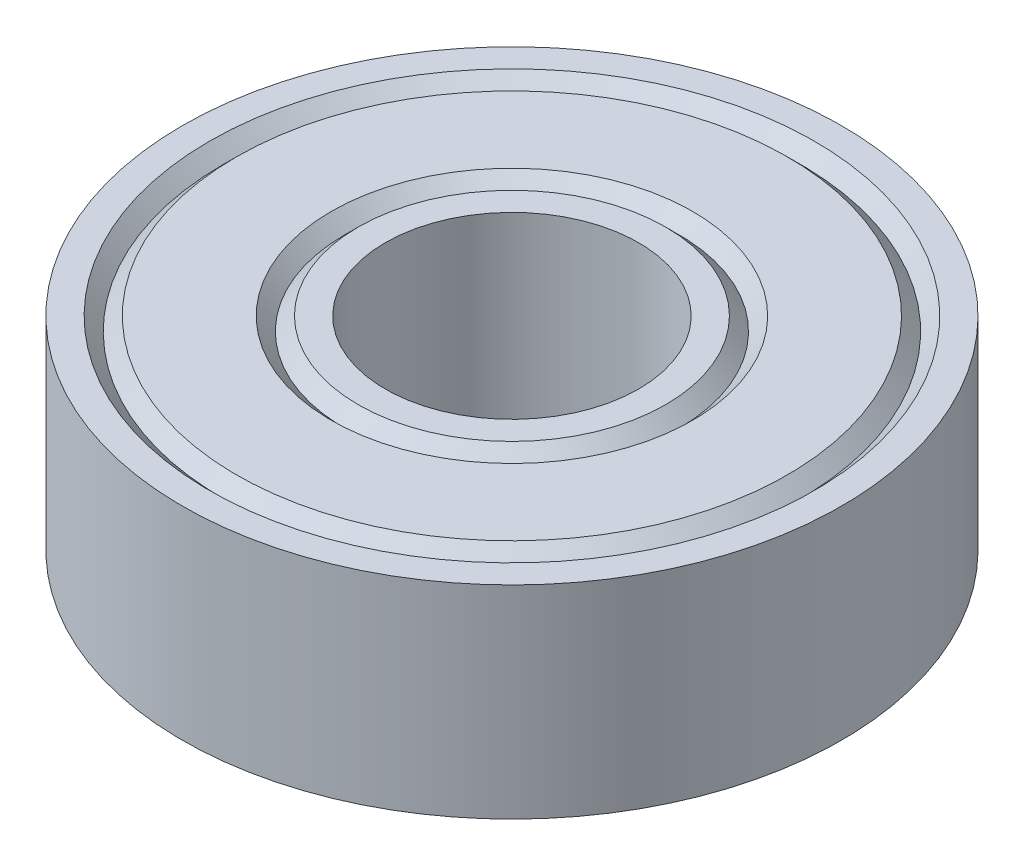
ISO-10303-21;
HEADER;
FILE_DESCRIPTION(('STEP AP214'),'2;1');
FILE_NAME('part.step','',(''),(''),'','','');
FILE_SCHEMA(('AUTOMOTIVE_DESIGN { 1 0 10303 214 1 1 1 1 }'));
ENDSEC;
DATA;
#1=APPLICATION_CONTEXT('core data for automotive mechanical design processes');
#2=APPLICATION_PROTOCOL_DEFINITION('international standard','automotive_design',2000,#1);
#3=PRODUCT_CONTEXT('',#1,'mechanical');
#4=PRODUCT('Part','Part','',(#3));
#5=PRODUCT_RELATED_PRODUCT_CATEGORY('part','',(#4));
#6=PRODUCT_DEFINITION_FORMATION('','',#4);
#7=PRODUCT_DEFINITION_CONTEXT('part definition',#1,'design');
#8=PRODUCT_DEFINITION('design','',#6,#7);
#9=PRODUCT_DEFINITION_SHAPE('','',#8);
#10=(LENGTH_UNIT() NAMED_UNIT(*) SI_UNIT(.MILLI.,.METRE.));
#11=(NAMED_UNIT(*) PLANE_ANGLE_UNIT() SI_UNIT($,.RADIAN.));
#12=(NAMED_UNIT(*) SI_UNIT($,.STERADIAN.) SOLID_ANGLE_UNIT());
#13=UNCERTAINTY_MEASURE_WITH_UNIT(LENGTH_MEASURE(1.E-05),#10,'distance_accuracy_value','');
#14=(GEOMETRIC_REPRESENTATION_CONTEXT(3) GLOBAL_UNCERTAINTY_ASSIGNED_CONTEXT((#13)) GLOBAL_UNIT_ASSIGNED_CONTEXT((#10,
#11,#12)) REPRESENTATION_CONTEXT('',''));
#15=CARTESIAN_POINT('',(0.,0.,0.));
#16=DIRECTION('',(0.,0.,1.));
#17=DIRECTION('',(1.,0.,0.));
#18=AXIS2_PLACEMENT_3D('',#15,#16,#17);
#19=CARTESIAN_POINT('',(0.,2.,0.));
#20=DIRECTION('',(0.,1.,0.));
#21=DIRECTION('',(-1.,0.,0.));
#22=AXIS2_PLACEMENT_3D('',#19,#20,#21);
#23=CYLINDRICAL_SURFACE('',#22,2.5);
#24=CARTESIAN_POINT('',(0.,2.,0.));
#25=DIRECTION('',(0.,1.,0.));
#26=DIRECTION('',(-1.,0.,0.));
#27=AXIS2_PLACEMENT_3D('',#24,#25,#26);
#28=CIRCLE('',#27,2.5);
#29=CARTESIAN_POINT('',(-2.5,2.,0.));
#30=VERTEX_POINT('',#29);
#31=EDGE_CURVE('E83',#30,#30,#28,.T.);
#32=ORIENTED_EDGE('',*,*,#31,.T.);
#33=EDGE_LOOP('',(#32));
#34=FACE_BOUND('',#33,.T.);
#35=CARTESIAN_POINT('',(0.,-2.,0.));
#36=DIRECTION('',(0.,1.,0.));
#37=DIRECTION('',(-1.,0.,0.));
#38=AXIS2_PLACEMENT_3D('',#35,#36,#37);
#39=CIRCLE('',#38,2.5);
#40=CARTESIAN_POINT('',(-2.5,-2.,0.));
#41=VERTEX_POINT('',#40);
#42=EDGE_CURVE('E10',#41,#41,#39,.T.);
#43=ORIENTED_EDGE('',*,*,#42,.F.);
#44=EDGE_LOOP('',(#43));
#45=FACE_BOUND('',#44,.T.);
#46=ADVANCED_FACE('F31',(#34,#45),#23,.F.);
#47=CARTESIAN_POINT('',(-2.5,-2.,0.));
#48=DIRECTION('',(0.,-1.,0.));
#49=DIRECTION('',(1.,0.,0.));
#50=AXIS2_PLACEMENT_3D('',#47,#48,#49);
#51=PLANE('',#50);
#52=ORIENTED_EDGE('',*,*,#42,.T.);
#53=EDGE_LOOP('',(#52));
#54=FACE_BOUND('',#53,.T.);
#55=CARTESIAN_POINT('',(0.,-2.,0.));
#56=DIRECTION('',(0.,1.,0.));
#57=DIRECTION('',(-1.,0.,0.));
#58=AXIS2_PLACEMENT_3D('',#55,#56,#57);
#59=CIRCLE('',#58,3.03333333333333);
#60=CARTESIAN_POINT('',(-3.03333333333333,-2.,0.));
#61=VERTEX_POINT('',#60);
#62=EDGE_CURVE('E37',#61,#61,#59,.T.);
#63=ORIENTED_EDGE('',*,*,#62,.F.);
#64=EDGE_LOOP('',(#63));
#65=FACE_BOUND('',#64,.T.);
#66=ADVANCED_FACE('F101',(#54,#65),#51,.T.);
#67=CARTESIAN_POINT('',(0.,-1.73333333333334,0.));
#68=DIRECTION('',(0.,1.,0.));
#69=DIRECTION('',(-1.,0.,0.));
#70=AXIS2_PLACEMENT_3D('',#67,#68,#69);
#71=CONICAL_SURFACE('',#70,3.3,0.785398163397448);
#72=ORIENTED_EDGE('',*,*,#62,.T.);
#73=EDGE_LOOP('',(#72));
#74=FACE_BOUND('',#73,.T.);
#75=CARTESIAN_POINT('',(0.,-1.73333333333334,0.));
#76=DIRECTION('',(0.,1.,0.));
#77=DIRECTION('',(-1.,0.,0.));
#78=AXIS2_PLACEMENT_3D('',#75,#76,#77);
#79=CIRCLE('',#78,3.3);
#80=CARTESIAN_POINT('',(-3.3,-1.73333333333334,0.));
#81=VERTEX_POINT('',#80);
#82=EDGE_CURVE('E41',#81,#81,#79,.T.);
#83=ORIENTED_EDGE('',*,*,#82,.F.);
#84=EDGE_LOOP('',(#83));
#85=FACE_BOUND('',#84,.T.);
#86=ADVANCED_FACE('F105',(#74,#85),#71,.T.);
#87=CARTESIAN_POINT('',(0.,-2.,0.));
#88=DIRECTION('',(0.,-1.,0.));
#89=DIRECTION('',(1.,0.,0.));
#90=AXIS2_PLACEMENT_3D('',#87,#88,#89);
#91=CONICAL_SURFACE('',#90,3.56666666666666,0.78539816339745);
#92=ORIENTED_EDGE('',*,*,#82,.T.);
#93=EDGE_LOOP('',(#92));
#94=FACE_BOUND('',#93,.T.);
#95=CARTESIAN_POINT('',(0.,-2.,0.));
#96=DIRECTION('',(0.,1.,0.));
#97=DIRECTION('',(-1.,0.,0.));
#98=AXIS2_PLACEMENT_3D('',#95,#96,#97);
#99=CIRCLE('',#98,3.56666666666666);
#100=CARTESIAN_POINT('',(-3.56666666666666,-2.,0.));
#101=VERTEX_POINT('',#100);
#102=EDGE_CURVE('E45',#101,#101,#99,.T.);
#103=ORIENTED_EDGE('',*,*,#102,.F.);
#104=EDGE_LOOP('',(#103));
#105=FACE_BOUND('',#104,.T.);
#106=ADVANCED_FACE('F109',(#94,#105),#91,.F.);
#107=CARTESIAN_POINT('',(-3.56666666666666,-2.,0.));
#108=DIRECTION('',(0.,-1.,0.));
#109=DIRECTION('',(1.,0.,0.));
#110=AXIS2_PLACEMENT_3D('',#107,#108,#109);
#111=PLANE('',#110);
#112=ORIENTED_EDGE('',*,*,#102,.T.);
#113=EDGE_LOOP('',(#112));
#114=FACE_BOUND('',#113,.T.);
#115=CARTESIAN_POINT('',(0.,-2.,0.));
#116=DIRECTION('',(0.,1.,0.));
#117=DIRECTION('',(-1.,0.,0.));
#118=AXIS2_PLACEMENT_3D('',#115,#116,#117);
#119=CIRCLE('',#118,5.43333333333333);
#120=CARTESIAN_POINT('',(-5.43333333333333,-2.,0.));
#121=VERTEX_POINT('',#120);
#122=EDGE_CURVE('E50',#121,#121,#119,.T.);
#123=ORIENTED_EDGE('',*,*,#122,.F.);
#124=EDGE_LOOP('',(#123));
#125=FACE_BOUND('',#124,.T.);
#126=ADVANCED_FACE('F115',(#114,#125),#111,.T.);
#127=CARTESIAN_POINT('',(0.,-1.73333333333334,0.));
#128=DIRECTION('',(0.,1.,0.));
#129=DIRECTION('',(-1.,0.,0.));
#130=AXIS2_PLACEMENT_3D('',#127,#128,#129);
#131=CONICAL_SURFACE('',#130,5.7,0.785398163397448);
#132=ORIENTED_EDGE('',*,*,#122,.T.);
#133=EDGE_LOOP('',(#132));
#134=FACE_BOUND('',#133,.T.);
#135=CARTESIAN_POINT('',(0.,-1.73333333333334,0.));
#136=DIRECTION('',(0.,1.,0.));
#137=DIRECTION('',(-1.,0.,0.));
#138=AXIS2_PLACEMENT_3D('',#135,#136,#137);
#139=CIRCLE('',#138,5.7);
#140=CARTESIAN_POINT('',(-5.7,-1.73333333333334,0.));
#141=VERTEX_POINT('',#140);
#142=EDGE_CURVE('E53',#141,#141,#139,.T.);
#143=ORIENTED_EDGE('',*,*,#142,.F.);
#144=EDGE_LOOP('',(#143));
#145=FACE_BOUND('',#144,.T.);
#146=ADVANCED_FACE('F119',(#134,#145),#131,.T.);
#147=CARTESIAN_POINT('',(0.,-2.,0.));
#148=DIRECTION('',(0.,-1.,0.));
#149=DIRECTION('',(1.,0.,0.));
#150=AXIS2_PLACEMENT_3D('',#147,#148,#149);
#151=CONICAL_SURFACE('',#150,5.96666666666666,0.785398163397447);
#152=ORIENTED_EDGE('',*,*,#142,.T.);
#153=EDGE_LOOP('',(#152));
#154=FACE_BOUND('',#153,.T.);
#155=CARTESIAN_POINT('',(0.,-2.,0.));
#156=DIRECTION('',(0.,1.,0.));
#157=DIRECTION('',(-1.,0.,0.));
#158=AXIS2_PLACEMENT_3D('',#155,#156,#157);
#159=CIRCLE('',#158,5.96666666666666);
#160=CARTESIAN_POINT('',(-5.96666666666666,-2.,0.));
#161=VERTEX_POINT('',#160);
#162=EDGE_CURVE('E56',#161,#161,#159,.T.);
#163=ORIENTED_EDGE('',*,*,#162,.F.);
#164=EDGE_LOOP('',(#163));
#165=FACE_BOUND('',#164,.T.);
#166=ADVANCED_FACE('F123',(#154,#165),#151,.F.);
#167=CARTESIAN_POINT('',(-5.96666666666666,-2.,0.));
#168=DIRECTION('',(0.,-1.,0.));
#169=DIRECTION('',(1.,0.,0.));
#170=AXIS2_PLACEMENT_3D('',#167,#168,#169);
#171=PLANE('',#170);
#172=ORIENTED_EDGE('',*,*,#162,.T.);
#173=EDGE_LOOP('',(#172));
#174=FACE_BOUND('',#173,.T.);
#175=CARTESIAN_POINT('',(0.,-2.,0.));
#176=DIRECTION('',(0.,1.,0.));
#177=DIRECTION('',(-1.,0.,0.));
#178=AXIS2_PLACEMENT_3D('',#175,#176,#177);
#179=CIRCLE('',#178,6.5);
#180=CARTESIAN_POINT('',(-6.5,-2.,0.));
#181=VERTEX_POINT('',#180);
#182=EDGE_CURVE('E59',#181,#181,#179,.T.);
#183=ORIENTED_EDGE('',*,*,#182,.F.);
#184=EDGE_LOOP('',(#183));
#185=FACE_BOUND('',#184,.T.);
#186=ADVANCED_FACE('F127',(#174,#185),#171,.T.);
#187=CARTESIAN_POINT('',(0.,2.,0.));
#188=DIRECTION('',(0.,1.,0.));
#189=DIRECTION('',(-1.,0.,0.));
#190=AXIS2_PLACEMENT_3D('',#187,#188,#189);
#191=CYLINDRICAL_SURFACE('',#190,6.5);
#192=ORIENTED_EDGE('',*,*,#182,.T.);
#193=EDGE_LOOP('',(#192));
#194=FACE_BOUND('',#193,.T.);
#195=CARTESIAN_POINT('',(0.,2.,0.));
#196=DIRECTION('',(0.,1.,0.));
#197=DIRECTION('',(-1.,0.,0.));
#198=AXIS2_PLACEMENT_3D('',#195,#196,#197);
#199=CIRCLE('',#198,6.49999999999999);
#200=CARTESIAN_POINT('',(-6.49999999999999,2.,0.));
#201=VERTEX_POINT('',#200);
#202=EDGE_CURVE('E62',#201,#201,#199,.T.);
#203=ORIENTED_EDGE('',*,*,#202,.F.);
#204=EDGE_LOOP('',(#203));
#205=FACE_BOUND('',#204,.T.);
#206=ADVANCED_FACE('F131',(#194,#205),#191,.T.);
#207=CARTESIAN_POINT('',(-5.96666666666666,2.,0.));
#208=DIRECTION('',(0.,1.,0.));
#209=DIRECTION('',(-1.,0.,0.));
#210=AXIS2_PLACEMENT_3D('',#207,#208,#209);
#211=PLANE('',#210);
#212=ORIENTED_EDGE('',*,*,#202,.T.);
#213=EDGE_LOOP('',(#212));
#214=FACE_BOUND('',#213,.T.);
#215=CARTESIAN_POINT('',(0.,2.,0.));
#216=DIRECTION('',(0.,1.,0.));
#217=DIRECTION('',(-1.,0.,0.));
#218=AXIS2_PLACEMENT_3D('',#215,#216,#217);
#219=CIRCLE('',#218,5.96666666666666);
#220=CARTESIAN_POINT('',(-5.96666666666666,2.,0.));
#221=VERTEX_POINT('',#220);
#222=EDGE_CURVE('E65',#221,#221,#219,.T.);
#223=ORIENTED_EDGE('',*,*,#222,.F.);
#224=EDGE_LOOP('',(#223));
#225=FACE_BOUND('',#224,.T.);
#226=ADVANCED_FACE('F135',(#214,#225),#211,.T.);
#227=CARTESIAN_POINT('',(0.,1.73333333333334,0.));
#228=DIRECTION('',(0.,1.,0.));
#229=DIRECTION('',(-1.,0.,0.));
#230=AXIS2_PLACEMENT_3D('',#227,#228,#229);
#231=CONICAL_SURFACE('',#230,5.7,0.785398163397447);
#232=ORIENTED_EDGE('',*,*,#222,.T.);
#233=EDGE_LOOP('',(#232));
#234=FACE_BOUND('',#233,.T.);
#235=CARTESIAN_POINT('',(0.,1.73333333333334,0.));
#236=DIRECTION('',(0.,1.,0.));
#237=DIRECTION('',(-1.,0.,0.));
#238=AXIS2_PLACEMENT_3D('',#235,#236,#237);
#239=CIRCLE('',#238,5.7);
#240=CARTESIAN_POINT('',(-5.7,1.73333333333334,0.));
#241=VERTEX_POINT('',#240);
#242=EDGE_CURVE('E68',#241,#241,#239,.T.);
#243=ORIENTED_EDGE('',*,*,#242,.F.);
#244=EDGE_LOOP('',(#243));
#245=FACE_BOUND('',#244,.T.);
#246=ADVANCED_FACE('F139',(#234,#245),#231,.F.);
#247=CARTESIAN_POINT('',(0.,2.,0.));
#248=DIRECTION('',(0.,-1.,0.));
#249=DIRECTION('',(1.,0.,0.));
#250=AXIS2_PLACEMENT_3D('',#247,#248,#249);
#251=CONICAL_SURFACE('',#250,5.43333333333333,0.785398163397449);
#252=ORIENTED_EDGE('',*,*,#242,.T.);
#253=EDGE_LOOP('',(#252));
#254=FACE_BOUND('',#253,.T.);
#255=CARTESIAN_POINT('',(0.,2.,0.));
#256=DIRECTION('',(0.,1.,0.));
#257=DIRECTION('',(-1.,0.,0.));
#258=AXIS2_PLACEMENT_3D('',#255,#256,#257);
#259=CIRCLE('',#258,5.43333333333333);
#260=CARTESIAN_POINT('',(-5.43333333333333,2.,0.));
#261=VERTEX_POINT('',#260);
#262=EDGE_CURVE('E71',#261,#261,#259,.T.);
#263=ORIENTED_EDGE('',*,*,#262,.F.);
#264=EDGE_LOOP('',(#263));
#265=FACE_BOUND('',#264,.T.);
#266=ADVANCED_FACE('F143',(#254,#265),#251,.T.);
#267=CARTESIAN_POINT('',(-3.56666666666666,2.,0.));
#268=DIRECTION('',(0.,1.,0.));
#269=DIRECTION('',(-1.,0.,0.));
#270=AXIS2_PLACEMENT_3D('',#267,#268,#269);
#271=PLANE('',#270);
#272=ORIENTED_EDGE('',*,*,#262,.T.);
#273=EDGE_LOOP('',(#272));
#274=FACE_BOUND('',#273,.T.);
#275=CARTESIAN_POINT('',(0.,2.,0.));
#276=DIRECTION('',(0.,1.,0.));
#277=DIRECTION('',(-1.,0.,0.));
#278=AXIS2_PLACEMENT_3D('',#275,#276,#277);
#279=CIRCLE('',#278,3.56666666666666);
#280=CARTESIAN_POINT('',(-3.56666666666666,2.,0.));
#281=VERTEX_POINT('',#280);
#282=EDGE_CURVE('E74',#281,#281,#279,.T.);
#283=ORIENTED_EDGE('',*,*,#282,.F.);
#284=EDGE_LOOP('',(#283));
#285=FACE_BOUND('',#284,.T.);
#286=ADVANCED_FACE('F147',(#274,#285),#271,.T.);
#287=CARTESIAN_POINT('',(0.,1.73333333333334,0.));
#288=DIRECTION('',(0.,1.,0.));
#289=DIRECTION('',(-1.,0.,0.));
#290=AXIS2_PLACEMENT_3D('',#287,#288,#289);
#291=CONICAL_SURFACE('',#290,3.3,0.785398163397449);
#292=ORIENTED_EDGE('',*,*,#282,.T.);
#293=EDGE_LOOP('',(#292));
#294=FACE_BOUND('',#293,.T.);
#295=CARTESIAN_POINT('',(0.,1.73333333333334,0.));
#296=DIRECTION('',(0.,1.,0.));
#297=DIRECTION('',(-1.,0.,0.));
#298=AXIS2_PLACEMENT_3D('',#295,#296,#297);
#299=CIRCLE('',#298,3.3);
#300=CARTESIAN_POINT('',(-3.3,1.73333333333334,0.));
#301=VERTEX_POINT('',#300);
#302=EDGE_CURVE('E77',#301,#301,#299,.T.);
#303=ORIENTED_EDGE('',*,*,#302,.F.);
#304=EDGE_LOOP('',(#303));
#305=FACE_BOUND('',#304,.T.);
#306=ADVANCED_FACE('F97',(#294,#305),#291,.F.);
#307=CARTESIAN_POINT('',(0.,2.,0.));
#308=DIRECTION('',(0.,-1.,0.));
#309=DIRECTION('',(1.,0.,0.));
#310=AXIS2_PLACEMENT_3D('',#307,#308,#309);
#311=CONICAL_SURFACE('',#310,3.03333333333333,0.785398163397446);
#312=ORIENTED_EDGE('',*,*,#302,.T.);
#313=EDGE_LOOP('',(#312));
#314=FACE_BOUND('',#313,.T.);
#315=CARTESIAN_POINT('',(0.,2.,0.));
#316=DIRECTION('',(0.,1.,0.));
#317=DIRECTION('',(-1.,0.,0.));
#318=AXIS2_PLACEMENT_3D('',#315,#316,#317);
#319=CIRCLE('',#318,3.03333333333333);
#320=CARTESIAN_POINT('',(-3.03333333333333,2.,0.));
#321=VERTEX_POINT('',#320);
#322=EDGE_CURVE('E80',#321,#321,#319,.T.);
#323=ORIENTED_EDGE('',*,*,#322,.F.);
#324=EDGE_LOOP('',(#323));
#325=FACE_BOUND('',#324,.T.);
#326=ADVANCED_FACE('F91',(#314,#325),#311,.T.);
#327=CARTESIAN_POINT('',(-2.5,2.,0.));
#328=DIRECTION('',(0.,1.,0.));
#329=DIRECTION('',(-1.,0.,0.));
#330=AXIS2_PLACEMENT_3D('',#327,#328,#329);
#331=PLANE('',#330);
#332=ORIENTED_EDGE('',*,*,#322,.T.);
#333=EDGE_LOOP('',(#332));
#334=FACE_BOUND('',#333,.T.);
#335=ORIENTED_EDGE('',*,*,#31,.F.);
#336=EDGE_LOOP('',(#335));
#337=FACE_BOUND('',#336,.T.);
#338=ADVANCED_FACE('F89',(#334,#337),#331,.T.);
#339=CLOSED_SHELL('',(#46,#66,#86,#106,#126,#146,#166,#186,#206,#226,#246,#266,#286,#306,#326,#338));
#340=MANIFOLD_SOLID_BREP('B2',#339);
#341=ADVANCED_BREP_SHAPE_REPRESENTATION('',(#18,#340),#14);
#342=SHAPE_DEFINITION_REPRESENTATION(#9,#341);
ENDSEC;
END-ISO-10303-21;
